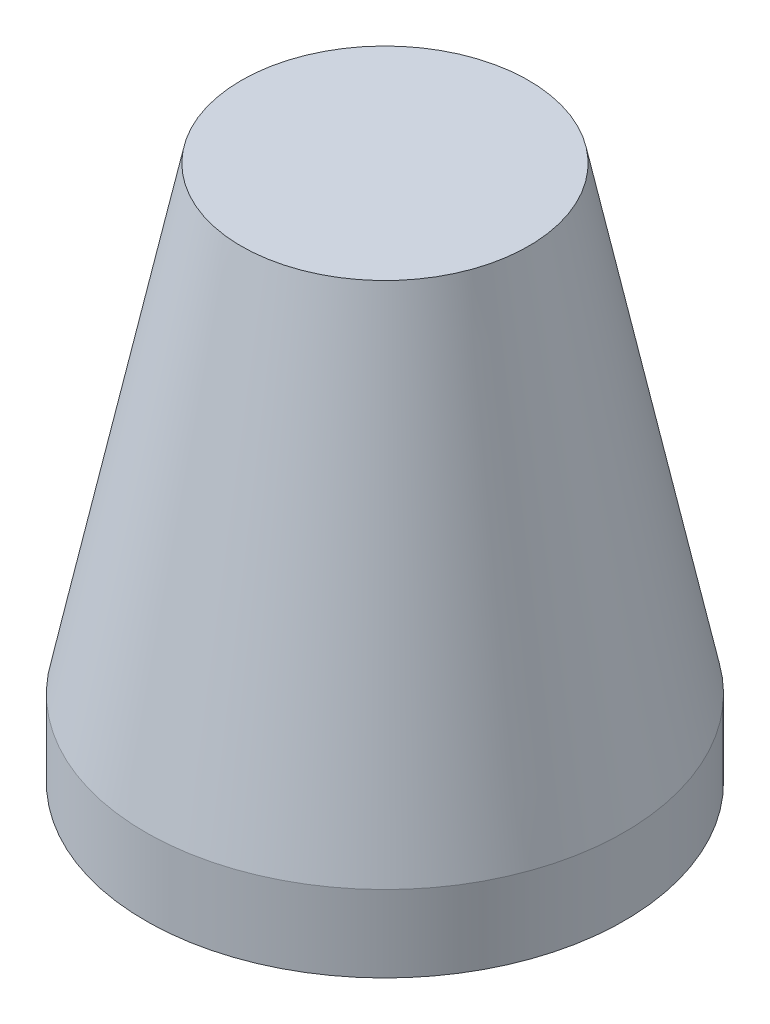
ISO-10303-21;
HEADER;
FILE_DESCRIPTION(('STEP AP214'),'2;1');
FILE_NAME('part.step','',(''),(''),'','','');
FILE_SCHEMA(('AUTOMOTIVE_DESIGN { 1 0 10303 214 1 1 1 1 }'));
ENDSEC;
DATA;
#1=APPLICATION_CONTEXT('core data for automotive mechanical design processes');
#2=APPLICATION_PROTOCOL_DEFINITION('international standard','automotive_design',2000,#1);
#3=PRODUCT_CONTEXT('',#1,'mechanical');
#4=PRODUCT('Part','Part','',(#3));
#5=PRODUCT_RELATED_PRODUCT_CATEGORY('part','',(#4));
#6=PRODUCT_DEFINITION_FORMATION('','',#4);
#7=PRODUCT_DEFINITION_CONTEXT('part definition',#1,'design');
#8=PRODUCT_DEFINITION('design','',#6,#7);
#9=PRODUCT_DEFINITION_SHAPE('','',#8);
#10=(LENGTH_UNIT() NAMED_UNIT(*) SI_UNIT(.MILLI.,.METRE.));
#11=(NAMED_UNIT(*) PLANE_ANGLE_UNIT() SI_UNIT($,.RADIAN.));
#12=(NAMED_UNIT(*) SI_UNIT($,.STERADIAN.) SOLID_ANGLE_UNIT());
#13=UNCERTAINTY_MEASURE_WITH_UNIT(LENGTH_MEASURE(1.E-05),#10,'distance_accuracy_value','');
#14=(GEOMETRIC_REPRESENTATION_CONTEXT(3) GLOBAL_UNCERTAINTY_ASSIGNED_CONTEXT((#13)) GLOBAL_UNIT_ASSIGNED_CONTEXT((#10,
#11,#12)) REPRESENTATION_CONTEXT('',''));
#15=CARTESIAN_POINT('',(0.,0.,0.));
#16=DIRECTION('',(0.,0.,1.));
#17=DIRECTION('',(1.,0.,0.));
#18=AXIS2_PLACEMENT_3D('',#15,#16,#17);
#19=CARTESIAN_POINT('',(0.,0.,0.));
#20=DIRECTION('',(0.,-1.,0.));
#21=DIRECTION('',(1.,0.,0.));
#22=AXIS2_PLACEMENT_3D('',#19,#20,#21);
#23=PLANE('',#22);
#24=CARTESIAN_POINT('',(0.,0.,0.));
#25=DIRECTION('',(0.,1.,0.));
#26=DIRECTION('',(-1.,0.,0.));
#27=AXIS2_PLACEMENT_3D('',#24,#25,#26);
#28=CIRCLE('',#27,25.);
#29=CARTESIAN_POINT('',(-25.,0.,0.));
#30=VERTEX_POINT('',#29);
#31=EDGE_CURVE('E10',#30,#30,#28,.T.);
#32=ORIENTED_EDGE('',*,*,#31,.F.);
#33=EDGE_LOOP('',(#32));
#34=FACE_BOUND('',#33,.T.);
#35=ADVANCED_FACE('F41',(#34),#23,.T.);
#36=CARTESIAN_POINT('',(0.,56.,0.));
#37=DIRECTION('',(0.,1.,0.));
#38=DIRECTION('',(-1.,0.,0.));
#39=AXIS2_PLACEMENT_3D('',#36,#37,#38);
#40=CYLINDRICAL_SURFACE('',#39,25.);
#41=ORIENTED_EDGE('',*,*,#31,.T.);
#42=EDGE_LOOP('',(#41));
#43=FACE_BOUND('',#42,.T.);
#44=CARTESIAN_POINT('',(0.,8.,0.));
#45=DIRECTION('',(0.,1.,0.));
#46=DIRECTION('',(-1.,0.,0.));
#47=AXIS2_PLACEMENT_3D('',#44,#45,#46);
#48=CIRCLE('',#47,25.);
#49=CARTESIAN_POINT('',(-25.,8.,0.));
#50=VERTEX_POINT('',#49);
#51=EDGE_CURVE('E48',#50,#50,#48,.T.);
#52=ORIENTED_EDGE('',*,*,#51,.F.);
#53=EDGE_LOOP('',(#52));
#54=FACE_BOUND('',#53,.T.);
#55=ADVANCED_FACE('F65',(#43,#54),#40,.T.);
#56=CARTESIAN_POINT('',(0.,56.,0.));
#57=DIRECTION('',(0.,-1.,0.));
#58=DIRECTION('',(1.,0.,0.));
#59=AXIS2_PLACEMENT_3D('',#56,#57,#58);
#60=CONICAL_SURFACE('',#59,15.,0.205395389189767);
#61=ORIENTED_EDGE('',*,*,#51,.T.);
#62=EDGE_LOOP('',(#61));
#63=FACE_BOUND('',#62,.T.);
#64=CARTESIAN_POINT('',(0.,56.,0.));
#65=DIRECTION('',(0.,1.,0.));
#66=DIRECTION('',(-1.,0.,0.));
#67=AXIS2_PLACEMENT_3D('',#64,#65,#66);
#68=CIRCLE('',#67,15.);
#69=CARTESIAN_POINT('',(-15.,56.,0.));
#70=VERTEX_POINT('',#69);
#71=EDGE_CURVE('E53',#70,#70,#68,.T.);
#72=ORIENTED_EDGE('',*,*,#71,.F.);
#73=EDGE_LOOP('',(#72));
#74=FACE_BOUND('',#73,.T.);
#75=ADVANCED_FACE('F63',(#63,#74),#60,.T.);
#76=CARTESIAN_POINT('',(-15.,56.,0.));
#77=DIRECTION('',(0.,1.,0.));
#78=DIRECTION('',(-1.,0.,0.));
#79=AXIS2_PLACEMENT_3D('',#76,#77,#78);
#80=PLANE('',#79);
#81=ORIENTED_EDGE('',*,*,#71,.T.);
#82=EDGE_LOOP('',(#81));
#83=FACE_BOUND('',#82,.T.);
#84=ADVANCED_FACE('F61',(#83),#80,.T.);
#85=CLOSED_SHELL('',(#35,#55,#75,#84));
#86=MANIFOLD_SOLID_BREP('B2',#85);
#87=ADVANCED_BREP_SHAPE_REPRESENTATION('',(#18,#86),#14);
#88=SHAPE_DEFINITION_REPRESENTATION(#9,#87);
ENDSEC;
END-ISO-10303-21;
